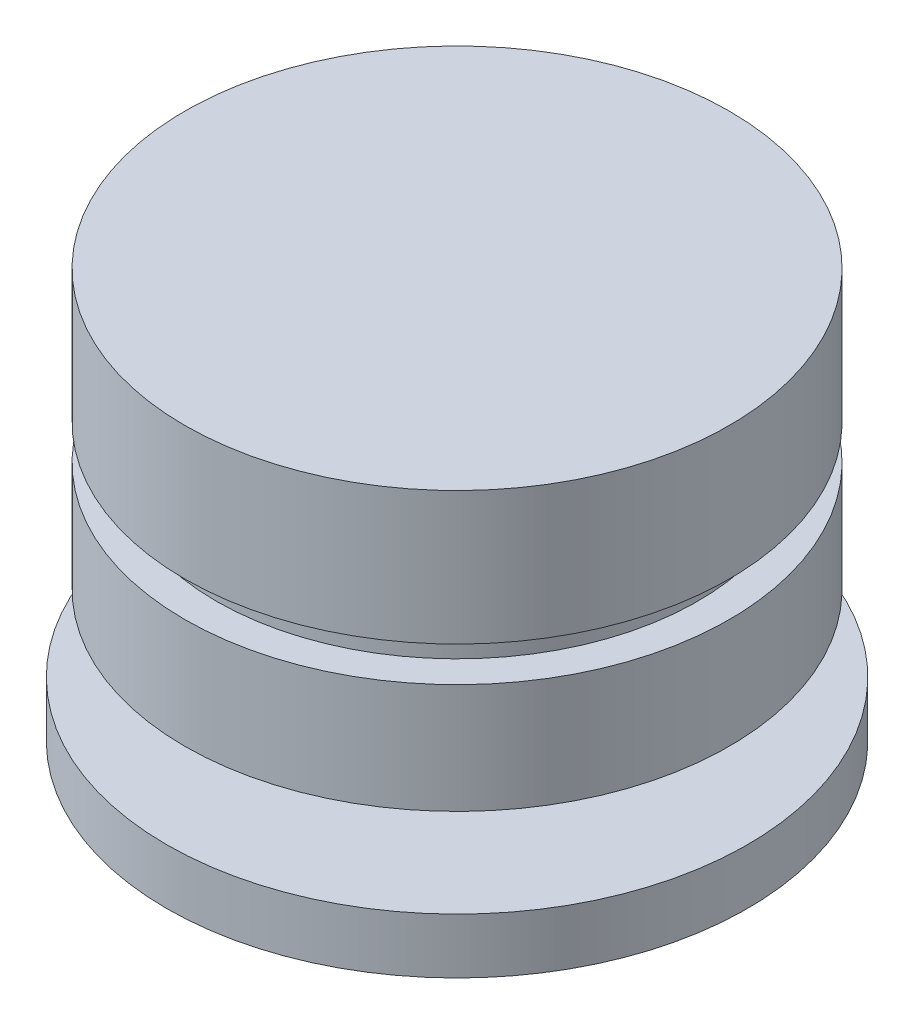
ISO-10303-21;
HEADER;
FILE_DESCRIPTION(('STEP AP214'),'2;1');
FILE_NAME('part.step','',(''),(''),'','','');
FILE_SCHEMA(('AUTOMOTIVE_DESIGN { 1 0 10303 214 1 1 1 1 }'));
ENDSEC;
DATA;
#1=APPLICATION_CONTEXT('core data for automotive mechanical design processes');
#2=APPLICATION_PROTOCOL_DEFINITION('international standard','automotive_design',2000,#1);
#3=PRODUCT_CONTEXT('',#1,'mechanical');
#4=PRODUCT('Part','Part','',(#3));
#5=PRODUCT_RELATED_PRODUCT_CATEGORY('part','',(#4));
#6=PRODUCT_DEFINITION_FORMATION('','',#4);
#7=PRODUCT_DEFINITION_CONTEXT('part definition',#1,'design');
#8=PRODUCT_DEFINITION('design','',#6,#7);
#9=PRODUCT_DEFINITION_SHAPE('','',#8);
#10=(LENGTH_UNIT() NAMED_UNIT(*) SI_UNIT(.MILLI.,.METRE.));
#11=(NAMED_UNIT(*) PLANE_ANGLE_UNIT() SI_UNIT($,.RADIAN.));
#12=(NAMED_UNIT(*) SI_UNIT($,.STERADIAN.) SOLID_ANGLE_UNIT());
#13=UNCERTAINTY_MEASURE_WITH_UNIT(LENGTH_MEASURE(1.E-05),#10,'distance_accuracy_value','');
#14=(GEOMETRIC_REPRESENTATION_CONTEXT(3) GLOBAL_UNCERTAINTY_ASSIGNED_CONTEXT((#13)) GLOBAL_UNIT_ASSIGNED_CONTEXT((#10,
#11,#12)) REPRESENTATION_CONTEXT('',''));
#15=CARTESIAN_POINT('',(0.,0.,0.));
#16=DIRECTION('',(0.,0.,1.));
#17=DIRECTION('',(1.,0.,0.));
#18=AXIS2_PLACEMENT_3D('',#15,#16,#17);
#19=CARTESIAN_POINT('',(0.,73.98006,0.));
#20=DIRECTION('',(0.,-1.,0.));
#21=DIRECTION('',(0.,0.,-1.));
#22=AXIS2_PLACEMENT_3D('',#19,#20,#21);
#23=CYLINDRICAL_SURFACE('',#22,49.2125);
#24=CARTESIAN_POINT('',(0.,23.74902,0.));
#25=DIRECTION('',(0.,1.,0.));
#26=DIRECTION('',(0.,0.,1.));
#27=AXIS2_PLACEMENT_3D('',#24,#25,#26);
#28=CIRCLE('',#27,49.2125);
#29=CARTESIAN_POINT('',(0.,23.74902,49.2125));
#30=VERTEX_POINT('',#29);
#31=EDGE_CURVE('E64',#30,#30,#28,.T.);
#32=ORIENTED_EDGE('',*,*,#31,.T.);
#33=EDGE_LOOP('',(#32));
#34=FACE_BOUND('',#33,.T.);
#35=CARTESIAN_POINT('',(0.,43.59404,0.));
#36=DIRECTION('',(0.,1.,0.));
#37=DIRECTION('',(0.,0.,1.));
#38=AXIS2_PLACEMENT_3D('',#35,#36,#37);
#39=CIRCLE('',#38,49.2125);
#40=CARTESIAN_POINT('',(0.,43.59404,49.2125));
#41=VERTEX_POINT('',#40);
#42=EDGE_CURVE('E79',#41,#41,#39,.T.);
#43=ORIENTED_EDGE('',*,*,#42,.F.);
#44=EDGE_LOOP('',(#43));
#45=FACE_BOUND('',#44,.T.);
#46=ADVANCED_FACE('F43',(#34,#45),#23,.T.);
#47=CARTESIAN_POINT('',(0.,10.,0.));
#48=DIRECTION('',(0.,-1.,0.));
#49=DIRECTION('',(0.,0.,-1.));
#50=AXIS2_PLACEMENT_3D('',#47,#48,#49);
#51=CYLINDRICAL_SURFACE('',#50,52.500000029);
#52=CARTESIAN_POINT('',(0.,10.,0.));
#53=DIRECTION('',(0.,1.,0.));
#54=DIRECTION('',(0.,0.,1.));
#55=AXIS2_PLACEMENT_3D('',#52,#53,#54);
#56=CIRCLE('',#55,52.500000029);
#57=CARTESIAN_POINT('',(0.,10.,52.500000029));
#58=VERTEX_POINT('',#57);
#59=EDGE_CURVE('E52',#58,#58,#56,.T.);
#60=ORIENTED_EDGE('',*,*,#59,.F.);
#61=EDGE_LOOP('',(#60));
#62=FACE_BOUND('',#61,.T.);
#63=CARTESIAN_POINT('',(0.,0.,0.));
#64=DIRECTION('',(0.,1.,0.));
#65=DIRECTION('',(0.,0.,1.));
#66=AXIS2_PLACEMENT_3D('',#63,#64,#65);
#67=CIRCLE('',#66,52.500000029);
#68=CARTESIAN_POINT('',(0.,0.,52.500000029));
#69=VERTEX_POINT('',#68);
#70=EDGE_CURVE('E47',#69,#69,#67,.T.);
#71=ORIENTED_EDGE('',*,*,#70,.T.);
#72=EDGE_LOOP('',(#71));
#73=FACE_BOUND('',#72,.T.);
#74=ADVANCED_FACE('F45',(#62,#73),#51,.T.);
#75=CARTESIAN_POINT('',(0.,10.,0.));
#76=DIRECTION('',(0.,1.,0.));
#77=DIRECTION('',(0.,0.,1.));
#78=AXIS2_PLACEMENT_3D('',#75,#76,#77);
#79=PLANE('',#78);
#80=CARTESIAN_POINT('',(0.,10.,0.));
#81=DIRECTION('',(0.,1.,0.));
#82=DIRECTION('',(0.,0.,1.));
#83=AXIS2_PLACEMENT_3D('',#80,#81,#82);
#84=CIRCLE('',#83,25.4);
#85=CARTESIAN_POINT('',(0.,10.,25.4));
#86=VERTEX_POINT('',#85);
#87=EDGE_CURVE('E10',#86,#86,#84,.T.);
#88=ORIENTED_EDGE('',*,*,#87,.F.);
#89=EDGE_LOOP('',(#88));
#90=FACE_BOUND('',#89,.T.);
#91=ORIENTED_EDGE('',*,*,#59,.T.);
#92=EDGE_LOOP('',(#91));
#93=FACE_BOUND('',#92,.T.);
#94=ADVANCED_FACE('F112',(#90,#93),#79,.T.);
#95=CARTESIAN_POINT('',(0.,0.,0.));
#96=DIRECTION('',(0.,1.,0.));
#97=DIRECTION('',(0.,0.,1.));
#98=AXIS2_PLACEMENT_3D('',#95,#96,#97);
#99=PLANE('',#98);
#100=ORIENTED_EDGE('',*,*,#70,.F.);
#101=EDGE_LOOP('',(#100));
#102=FACE_BOUND('',#101,.T.);
#103=ADVANCED_FACE('F179',(#102),#99,.F.);
#104=CARTESIAN_POINT('',(0.,23.74902,0.));
#105=DIRECTION('',(0.,-1.,0.));
#106=DIRECTION('',(0.,0.,-1.));
#107=AXIS2_PLACEMENT_3D('',#104,#105,#106);
#108=CYLINDRICAL_SURFACE('',#107,25.4);
#109=CARTESIAN_POINT('',(0.,23.74902,0.));
#110=DIRECTION('',(0.,1.,0.));
#111=DIRECTION('',(0.,0.,1.));
#112=AXIS2_PLACEMENT_3D('',#109,#110,#111);
#113=CIRCLE('',#112,25.4);
#114=CARTESIAN_POINT('',(0.,23.74902,25.4));
#115=VERTEX_POINT('',#114);
#116=EDGE_CURVE('E59',#115,#115,#113,.T.);
#117=ORIENTED_EDGE('',*,*,#116,.F.);
#118=EDGE_LOOP('',(#117));
#119=FACE_BOUND('',#118,.T.);
#120=ORIENTED_EDGE('',*,*,#87,.T.);
#121=EDGE_LOOP('',(#120));
#122=FACE_BOUND('',#121,.T.);
#123=ADVANCED_FACE('F137',(#119,#122),#108,.T.);
#124=CARTESIAN_POINT('',(0.,23.74902,0.));
#125=DIRECTION('',(0.,1.,0.));
#126=DIRECTION('',(0.,0.,1.));
#127=AXIS2_PLACEMENT_3D('',#124,#125,#126);
#128=PLANE('',#127);
#129=ORIENTED_EDGE('',*,*,#116,.T.);
#130=EDGE_LOOP('',(#129));
#131=FACE_BOUND('',#130,.T.);
#132=ORIENTED_EDGE('',*,*,#31,.F.);
#133=EDGE_LOOP('',(#132));
#134=FACE_BOUND('',#133,.T.);
#135=ADVANCED_FACE('F140',(#131,#134),#128,.F.);
#136=CARTESIAN_POINT('',(0.,0.,0.));
#137=DIRECTION('',(0.,1.,0.));
#138=DIRECTION('',(0.,0.,1.));
#139=AXIS2_PLACEMENT_3D('',#136,#137,#138);
#140=CYLINDRICAL_SURFACE('',#139,43.4975);
#141=CARTESIAN_POINT('',(0.,43.59404,0.));
#142=DIRECTION('',(0.,1.,0.));
#143=DIRECTION('',(0.,0.,1.));
#144=AXIS2_PLACEMENT_3D('',#141,#142,#143);
#145=CIRCLE('',#144,43.4975);
#146=CARTESIAN_POINT('',(0.,43.59404,43.4975));
#147=VERTEX_POINT('',#146);
#148=EDGE_CURVE('E83',#147,#147,#145,.T.);
#149=ORIENTED_EDGE('',*,*,#148,.T.);
#150=EDGE_LOOP('',(#149));
#151=FACE_BOUND('',#150,.T.);
#152=CARTESIAN_POINT('',(0.,49.94404,0.));
#153=DIRECTION('',(0.,1.,0.));
#154=DIRECTION('',(0.,0.,1.));
#155=AXIS2_PLACEMENT_3D('',#152,#153,#154);
#156=CIRCLE('',#155,43.4975);
#157=CARTESIAN_POINT('',(0.,49.94404,43.4975));
#158=VERTEX_POINT('',#157);
#159=EDGE_CURVE('E68',#158,#158,#156,.T.);
#160=ORIENTED_EDGE('',*,*,#159,.F.);
#161=EDGE_LOOP('',(#160));
#162=FACE_BOUND('',#161,.T.);
#163=ADVANCED_FACE('F88',(#151,#162),#140,.T.);
#164=CARTESIAN_POINT('',(0.,49.94404,-49.2125));
#165=DIRECTION('',(0.,-1.,0.));
#166=DIRECTION('',(0.,0.,-1.));
#167=AXIS2_PLACEMENT_3D('',#164,#165,#166);
#168=PLANE('',#167);
#169=ORIENTED_EDGE('',*,*,#159,.T.);
#170=EDGE_LOOP('',(#169));
#171=FACE_BOUND('',#170,.T.);
#172=CARTESIAN_POINT('',(0.,49.94404,0.));
#173=DIRECTION('',(0.,1.,0.));
#174=DIRECTION('',(0.,0.,1.));
#175=AXIS2_PLACEMENT_3D('',#172,#173,#174);
#176=CIRCLE('',#175,49.2125);
#177=CARTESIAN_POINT('',(0.,49.94404,49.2125));
#178=VERTEX_POINT('',#177);
#179=EDGE_CURVE('E75',#178,#178,#176,.T.);
#180=ORIENTED_EDGE('',*,*,#179,.F.);
#181=EDGE_LOOP('',(#180));
#182=FACE_BOUND('',#181,.T.);
#183=ADVANCED_FACE('F94',(#171,#182),#168,.T.);
#184=CARTESIAN_POINT('',(0.,43.59404,-49.2125));
#185=DIRECTION('',(0.,1.,0.));
#186=DIRECTION('',(0.,0.,1.));
#187=AXIS2_PLACEMENT_3D('',#184,#185,#186);
#188=PLANE('',#187);
#189=ORIENTED_EDGE('',*,*,#42,.T.);
#190=EDGE_LOOP('',(#189));
#191=FACE_BOUND('',#190,.T.);
#192=ORIENTED_EDGE('',*,*,#148,.F.);
#193=EDGE_LOOP('',(#192));
#194=FACE_BOUND('',#193,.T.);
#195=ADVANCED_FACE('F91',(#191,#194),#188,.T.);
#196=CARTESIAN_POINT('',(0.,73.98006,0.));
#197=DIRECTION('',(0.,1.,0.));
#198=DIRECTION('',(0.,0.,1.));
#199=AXIS2_PLACEMENT_3D('',#196,#197,#198);
#200=PLANE('',#199);
#201=CARTESIAN_POINT('',(0.,73.98006,0.));
#202=DIRECTION('',(0.,1.,0.));
#203=DIRECTION('',(0.,0.,1.));
#204=AXIS2_PLACEMENT_3D('',#201,#202,#203);
#205=CIRCLE('',#204,49.2125);
#206=CARTESIAN_POINT('',(0.,73.98006,49.2125));
#207=VERTEX_POINT('',#206);
#208=EDGE_CURVE('E63',#207,#207,#205,.T.);
#209=ORIENTED_EDGE('',*,*,#208,.T.);
#210=EDGE_LOOP('',(#209));
#211=FACE_BOUND('',#210,.T.);
#212=ADVANCED_FACE('F93',(#211),#200,.T.);
#213=ORIENTED_EDGE('',*,*,#208,.F.);
#214=EDGE_LOOP('',(#213));
#215=FACE_BOUND('',#214,.T.);
#216=ORIENTED_EDGE('',*,*,#179,.T.);
#217=EDGE_LOOP('',(#216));
#218=FACE_BOUND('',#217,.T.);
#219=ADVANCED_FACE('F101',(#215,#218),#23,.T.);
#220=CLOSED_SHELL('',(#46,#74,#94,#103,#123,#135,#163,#183,#195,#212,#219));
#221=MANIFOLD_SOLID_BREP('B2',#220);
#222=ADVANCED_BREP_SHAPE_REPRESENTATION('',(#18,#221),#14);
#223=SHAPE_DEFINITION_REPRESENTATION(#9,#222);
ENDSEC;
END-ISO-10303-21;
